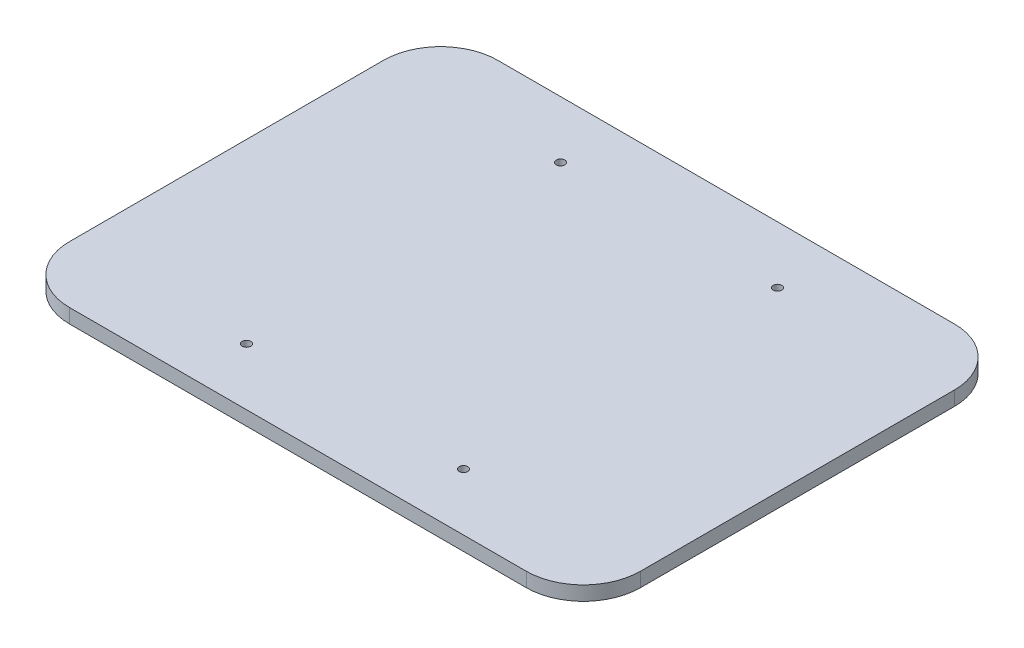
ISO-10303-21;
HEADER;
FILE_DESCRIPTION(('STEP AP214'),'2;1');
FILE_NAME('part.step','',(''),(''),'','','');
FILE_SCHEMA(('AUTOMOTIVE_DESIGN { 1 0 10303 214 1 1 1 1 }'));
ENDSEC;
DATA;
#1=APPLICATION_CONTEXT('core data for automotive mechanical design processes');
#2=APPLICATION_PROTOCOL_DEFINITION('international standard','automotive_design',2000,#1);
#3=PRODUCT_CONTEXT('',#1,'mechanical');
#4=PRODUCT('Part','Part','',(#3));
#5=PRODUCT_RELATED_PRODUCT_CATEGORY('part','',(#4));
#6=PRODUCT_DEFINITION_FORMATION('','',#4);
#7=PRODUCT_DEFINITION_CONTEXT('part definition',#1,'design');
#8=PRODUCT_DEFINITION('design','',#6,#7);
#9=PRODUCT_DEFINITION_SHAPE('','',#8);
#10=(LENGTH_UNIT() NAMED_UNIT(*) SI_UNIT(.MILLI.,.METRE.));
#11=(NAMED_UNIT(*) PLANE_ANGLE_UNIT() SI_UNIT($,.RADIAN.));
#12=(NAMED_UNIT(*) SI_UNIT($,.STERADIAN.) SOLID_ANGLE_UNIT());
#13=UNCERTAINTY_MEASURE_WITH_UNIT(LENGTH_MEASURE(1.E-05),#10,'distance_accuracy_value','');
#14=(GEOMETRIC_REPRESENTATION_CONTEXT(3) GLOBAL_UNCERTAINTY_ASSIGNED_CONTEXT((#13)) GLOBAL_UNIT_ASSIGNED_CONTEXT((#10,
#11,#12)) REPRESENTATION_CONTEXT('',''));
#15=CARTESIAN_POINT('',(0.,0.,0.));
#16=DIRECTION('',(0.,0.,1.));
#17=DIRECTION('',(1.,0.,0.));
#18=AXIS2_PLACEMENT_3D('',#15,#16,#17);
#19=CARTESIAN_POINT('',(119.18397760156,5.,-163.114483400198));
#20=DIRECTION('',(0.,-1.,0.));
#21=DIRECTION('',(0.,0.,-1.));
#22=AXIS2_PLACEMENT_3D('',#19,#20,#21);
#23=CYLINDRICAL_SURFACE('',#22,20.);
#24=CARTESIAN_POINT('',(119.18397760156,0.,-163.114483400198));
#25=DIRECTION('',(0.,1.,0.));
#26=DIRECTION('',(0.,0.,-1.));
#27=AXIS2_PLACEMENT_3D('',#24,#25,#26);
#28=CIRCLE('',#27,20.);
#29=CARTESIAN_POINT('',(139.18397760156,0.,-163.114483400198));
#30=VERTEX_POINT('',#29);
#31=CARTESIAN_POINT('',(119.18397760156,0.,-183.114483400198));
#32=VERTEX_POINT('',#31);
#33=EDGE_CURVE('E131',#30,#32,#28,.T.);
#34=ORIENTED_EDGE('',*,*,#33,.T.);
#35=DIRECTION('',(0.,-1.,0.));
#36=VECTOR('',#35,1.);
#37=CARTESIAN_POINT('',(119.18397760156,5.,-183.114483400198));
#38=LINE('',#37,#36);
#39=CARTESIAN_POINT('',(119.18397760156,5.,-183.114483400198));
#40=VERTEX_POINT('',#39);
#41=EDGE_CURVE('E11',#40,#32,#38,.T.);
#42=ORIENTED_EDGE('',*,*,#41,.F.);
#43=CARTESIAN_POINT('',(119.18397760156,5.,-163.114483400198));
#44=DIRECTION('',(0.,1.,0.));
#45=DIRECTION('',(0.,0.,-1.));
#46=AXIS2_PLACEMENT_3D('',#43,#44,#45);
#47=CIRCLE('',#46,20.);
#48=CARTESIAN_POINT('',(139.18397760156,5.,-163.114483400198));
#49=VERTEX_POINT('',#48);
#50=EDGE_CURVE('E146',#49,#40,#47,.T.);
#51=ORIENTED_EDGE('',*,*,#50,.F.);
#52=DIRECTION('',(0.,-1.,0.));
#53=VECTOR('',#52,1.);
#54=CARTESIAN_POINT('',(139.18397760156,5.,-163.114483400198));
#55=LINE('',#54,#53);
#56=EDGE_CURVE('E127',#49,#30,#55,.T.);
#57=ORIENTED_EDGE('',*,*,#56,.T.);
#58=EDGE_LOOP('',(#34,#42,#51,#57));
#59=FACE_BOUND('',#58,.T.);
#60=ADVANCED_FACE('F33',(#59),#23,.T.);
#61=CARTESIAN_POINT('',(-40.81602239844,5.,-183.114483400198));
#62=DIRECTION('',(0.,0.,1.));
#63=DIRECTION('',(1.,0.,0.));
#64=AXIS2_PLACEMENT_3D('',#61,#62,#63);
#65=PLANE('',#64);
#66=DIRECTION('',(-1.,0.,0.));
#67=VECTOR('',#66,1.);
#68=CARTESIAN_POINT('',(-40.81602239844,0.,-183.114483400198));
#69=LINE('',#68,#67);
#70=CARTESIAN_POINT('',(-40.81602239844,0.,-183.114483400198));
#71=VERTEX_POINT('',#70);
#72=EDGE_CURVE('E134',#32,#71,#69,.T.);
#73=ORIENTED_EDGE('',*,*,#72,.T.);
#74=DIRECTION('',(0.,-1.,0.));
#75=VECTOR('',#74,1.);
#76=CARTESIAN_POINT('',(-40.81602239844,5.,-183.114483400198));
#77=LINE('',#76,#75);
#78=CARTESIAN_POINT('',(-40.81602239844,5.,-183.114483400198));
#79=VERTEX_POINT('',#78);
#80=EDGE_CURVE('E42',#79,#71,#77,.T.);
#81=ORIENTED_EDGE('',*,*,#80,.F.);
#82=DIRECTION('',(-1.,0.,0.));
#83=VECTOR('',#82,1.);
#84=CARTESIAN_POINT('',(-40.81602239844,5.,-183.114483400198));
#85=LINE('',#84,#83);
#86=EDGE_CURVE('E94',#40,#79,#85,.T.);
#87=ORIENTED_EDGE('',*,*,#86,.F.);
#88=ORIENTED_EDGE('',*,*,#41,.T.);
#89=EDGE_LOOP('',(#73,#81,#87,#88));
#90=FACE_BOUND('',#89,.T.);
#91=ADVANCED_FACE('F213',(#90),#65,.F.);
#92=CARTESIAN_POINT('',(-40.81602239844,5.,-163.114483400198));
#93=DIRECTION('',(0.,-1.,0.));
#94=DIRECTION('',(0.,0.,-1.));
#95=AXIS2_PLACEMENT_3D('',#92,#93,#94);
#96=CYLINDRICAL_SURFACE('',#95,20.);
#97=CARTESIAN_POINT('',(-40.81602239844,0.,-163.114483400198));
#98=DIRECTION('',(0.,1.,0.));
#99=DIRECTION('',(0.,0.,1.));
#100=AXIS2_PLACEMENT_3D('',#97,#98,#99);
#101=CIRCLE('',#100,20.);
#102=CARTESIAN_POINT('',(-60.81602239844,0.,-163.114483400198));
#103=VERTEX_POINT('',#102);
#104=EDGE_CURVE('E137',#71,#103,#101,.T.);
#105=ORIENTED_EDGE('',*,*,#104,.T.);
#106=DIRECTION('',(0.,-1.,0.));
#107=VECTOR('',#106,1.);
#108=CARTESIAN_POINT('',(-60.81602239844,5.,-163.114483400198));
#109=LINE('',#108,#107);
#110=CARTESIAN_POINT('',(-60.81602239844,5.,-163.114483400198));
#111=VERTEX_POINT('',#110);
#112=EDGE_CURVE('E153',#111,#103,#109,.T.);
#113=ORIENTED_EDGE('',*,*,#112,.F.);
#114=CARTESIAN_POINT('',(-40.81602239844,5.,-163.114483400198));
#115=DIRECTION('',(0.,1.,0.));
#116=DIRECTION('',(0.,0.,1.));
#117=AXIS2_PLACEMENT_3D('',#114,#115,#116);
#118=CIRCLE('',#117,20.);
#119=EDGE_CURVE('E181',#79,#111,#118,.T.);
#120=ORIENTED_EDGE('',*,*,#119,.F.);
#121=ORIENTED_EDGE('',*,*,#80,.T.);
#122=EDGE_LOOP('',(#105,#113,#120,#121));
#123=FACE_BOUND('',#122,.T.);
#124=ADVANCED_FACE('F217',(#123),#96,.T.);
#125=CARTESIAN_POINT('',(-60.81602239844,5.,-163.114483400198));
#126=DIRECTION('',(1.,0.,0.));
#127=DIRECTION('',(0.,0.,-1.));
#128=AXIS2_PLACEMENT_3D('',#125,#126,#127);
#129=PLANE('',#128);
#130=DIRECTION('',(0.,0.,1.));
#131=VECTOR('',#130,1.);
#132=CARTESIAN_POINT('',(-60.81602239844,0.,-163.114483400198));
#133=LINE('',#132,#131);
#134=CARTESIAN_POINT('',(-60.81602239844,0.,-53.1144834001978));
#135=VERTEX_POINT('',#134);
#136=EDGE_CURVE('E139',#103,#135,#133,.T.);
#137=ORIENTED_EDGE('',*,*,#136,.T.);
#138=DIRECTION('',(0.,-1.,0.));
#139=VECTOR('',#138,1.);
#140=CARTESIAN_POINT('',(-60.81602239844,5.,-53.1144834001978));
#141=LINE('',#140,#139);
#142=CARTESIAN_POINT('',(-60.81602239844,5.,-53.1144834001978));
#143=VERTEX_POINT('',#142);
#144=EDGE_CURVE('E150',#143,#135,#141,.T.);
#145=ORIENTED_EDGE('',*,*,#144,.F.);
#146=DIRECTION('',(0.,0.,1.));
#147=VECTOR('',#146,1.);
#148=CARTESIAN_POINT('',(-60.81602239844,5.,-163.114483400198));
#149=LINE('',#148,#147);
#150=EDGE_CURVE('E183',#111,#143,#149,.T.);
#151=ORIENTED_EDGE('',*,*,#150,.F.);
#152=ORIENTED_EDGE('',*,*,#112,.T.);
#153=EDGE_LOOP('',(#137,#145,#151,#152));
#154=FACE_BOUND('',#153,.T.);
#155=ADVANCED_FACE('F189',(#154),#129,.F.);
#156=CARTESIAN_POINT('',(-40.81602239844,5.,-53.1144834001977));
#157=DIRECTION('',(0.,-1.,0.));
#158=DIRECTION('',(0.,0.,-1.));
#159=AXIS2_PLACEMENT_3D('',#156,#157,#158);
#160=CYLINDRICAL_SURFACE('',#159,20.);
#161=CARTESIAN_POINT('',(-40.81602239844,0.,-53.1144834001977));
#162=DIRECTION('',(0.,1.,0.));
#163=DIRECTION('',(0.,0.,1.));
#164=AXIS2_PLACEMENT_3D('',#161,#162,#163);
#165=CIRCLE('',#164,20.);
#166=CARTESIAN_POINT('',(-40.81602239844,0.,-33.1144834001977));
#167=VERTEX_POINT('',#166);
#168=EDGE_CURVE('E141',#135,#167,#165,.T.);
#169=ORIENTED_EDGE('',*,*,#168,.T.);
#170=DIRECTION('',(0.,-1.,0.));
#171=VECTOR('',#170,1.);
#172=CARTESIAN_POINT('',(-40.81602239844,5.,-33.1144834001977));
#173=LINE('',#172,#171);
#174=CARTESIAN_POINT('',(-40.81602239844,5.,-33.1144834001977));
#175=VERTEX_POINT('',#174);
#176=EDGE_CURVE('E122',#175,#167,#173,.T.);
#177=ORIENTED_EDGE('',*,*,#176,.F.);
#178=CARTESIAN_POINT('',(-40.81602239844,5.,-53.1144834001977));
#179=DIRECTION('',(0.,1.,0.));
#180=DIRECTION('',(0.,0.,1.));
#181=AXIS2_PLACEMENT_3D('',#178,#179,#180);
#182=CIRCLE('',#181,20.);
#183=EDGE_CURVE('E113',#143,#175,#182,.T.);
#184=ORIENTED_EDGE('',*,*,#183,.F.);
#185=ORIENTED_EDGE('',*,*,#144,.T.);
#186=EDGE_LOOP('',(#169,#177,#184,#185));
#187=FACE_BOUND('',#186,.T.);
#188=ADVANCED_FACE('F193',(#187),#160,.T.);
#189=CARTESIAN_POINT('',(-40.8160223984398,5.,-33.1144834001977));
#190=DIRECTION('',(0.,0.,-1.));
#191=DIRECTION('',(-1.,0.,0.));
#192=AXIS2_PLACEMENT_3D('',#189,#190,#191);
#193=PLANE('',#192);
#194=DIRECTION('',(1.,0.,0.));
#195=VECTOR('',#194,1.);
#196=CARTESIAN_POINT('',(-40.8160223984398,0.,-33.1144834001977));
#197=LINE('',#196,#195);
#198=CARTESIAN_POINT('',(119.18397760156,0.,-33.1144834001977));
#199=VERTEX_POINT('',#198);
#200=EDGE_CURVE('E121',#167,#199,#197,.T.);
#201=ORIENTED_EDGE('',*,*,#200,.T.);
#202=DIRECTION('',(0.,-1.,0.));
#203=VECTOR('',#202,1.);
#204=CARTESIAN_POINT('',(119.18397760156,5.,-33.1144834001977));
#205=LINE('',#204,#203);
#206=CARTESIAN_POINT('',(119.18397760156,5.,-33.1144834001977));
#207=VERTEX_POINT('',#206);
#208=EDGE_CURVE('E118',#207,#199,#205,.T.);
#209=ORIENTED_EDGE('',*,*,#208,.F.);
#210=DIRECTION('',(1.,0.,0.));
#211=VECTOR('',#210,1.);
#212=CARTESIAN_POINT('',(-40.8160223984398,5.,-33.1144834001977));
#213=LINE('',#212,#211);
#214=EDGE_CURVE('E107',#175,#207,#213,.T.);
#215=ORIENTED_EDGE('',*,*,#214,.F.);
#216=ORIENTED_EDGE('',*,*,#176,.T.);
#217=EDGE_LOOP('',(#201,#209,#215,#216));
#218=FACE_BOUND('',#217,.T.);
#219=ADVANCED_FACE('F119',(#218),#193,.F.);
#220=CARTESIAN_POINT('',(119.18397760156,5.,-53.1144834001977));
#221=DIRECTION('',(0.,-1.,0.));
#222=DIRECTION('',(0.,0.,-1.));
#223=AXIS2_PLACEMENT_3D('',#220,#221,#222);
#224=CYLINDRICAL_SURFACE('',#223,20.);
#225=CARTESIAN_POINT('',(119.18397760156,0.,-53.1144834001977));
#226=DIRECTION('',(0.,1.,0.));
#227=DIRECTION('',(0.,0.,1.));
#228=AXIS2_PLACEMENT_3D('',#225,#226,#227);
#229=CIRCLE('',#228,20.);
#230=CARTESIAN_POINT('',(139.18397760156,0.,-53.1144834001977));
#231=VERTEX_POINT('',#230);
#232=EDGE_CURVE('E80',#199,#231,#229,.T.);
#233=ORIENTED_EDGE('',*,*,#232,.T.);
#234=DIRECTION('',(0.,-1.,0.));
#235=VECTOR('',#234,1.);
#236=CARTESIAN_POINT('',(139.18397760156,5.,-53.1144834001977));
#237=LINE('',#236,#235);
#238=CARTESIAN_POINT('',(139.18397760156,5.,-53.1144834001977));
#239=VERTEX_POINT('',#238);
#240=EDGE_CURVE('E123',#239,#231,#237,.T.);
#241=ORIENTED_EDGE('',*,*,#240,.F.);
#242=CARTESIAN_POINT('',(119.18397760156,5.,-53.1144834001977));
#243=DIRECTION('',(0.,1.,0.));
#244=DIRECTION('',(0.,0.,1.));
#245=AXIS2_PLACEMENT_3D('',#242,#243,#244);
#246=CIRCLE('',#245,20.);
#247=EDGE_CURVE('E111',#207,#239,#246,.T.);
#248=ORIENTED_EDGE('',*,*,#247,.F.);
#249=ORIENTED_EDGE('',*,*,#208,.T.);
#250=EDGE_LOOP('',(#233,#241,#248,#249));
#251=FACE_BOUND('',#250,.T.);
#252=ADVANCED_FACE('F125',(#251),#224,.T.);
#253=CARTESIAN_POINT('',(139.18397760156,5.,-163.114483400198));
#254=DIRECTION('',(-1.,0.,0.));
#255=DIRECTION('',(0.,0.,1.));
#256=AXIS2_PLACEMENT_3D('',#253,#254,#255);
#257=PLANE('',#256);
#258=DIRECTION('',(0.,0.,-1.));
#259=VECTOR('',#258,1.);
#260=CARTESIAN_POINT('',(139.18397760156,0.,-163.114483400198));
#261=LINE('',#260,#259);
#262=EDGE_CURVE('E86',#231,#30,#261,.T.);
#263=ORIENTED_EDGE('',*,*,#262,.T.);
#264=ORIENTED_EDGE('',*,*,#56,.F.);
#265=DIRECTION('',(0.,0.,-1.));
#266=VECTOR('',#265,1.);
#267=CARTESIAN_POINT('',(139.18397760156,5.,-163.114483400198));
#268=LINE('',#267,#266);
#269=EDGE_CURVE('E51',#239,#49,#268,.T.);
#270=ORIENTED_EDGE('',*,*,#269,.F.);
#271=ORIENTED_EDGE('',*,*,#240,.T.);
#272=EDGE_LOOP('',(#263,#264,#270,#271));
#273=FACE_BOUND('',#272,.T.);
#274=ADVANCED_FACE('F201',(#273),#257,.F.);
#275=CARTESIAN_POINT('',(119.18397760156,5.,-163.114483400198));
#276=DIRECTION('',(0.,-1.,0.));
#277=DIRECTION('',(0.,0.,-1.));
#278=AXIS2_PLACEMENT_3D('',#275,#276,#277);
#279=PLANE('',#278);
#280=CARTESIAN_POINT('',(77.18397760156,5.,-163.114483400198));
#281=DIRECTION('',(0.,1.,0.));
#282=DIRECTION('',(0.,0.,1.));
#283=AXIS2_PLACEMENT_3D('',#280,#281,#282);
#284=CIRCLE('',#283,1.5);
#285=CARTESIAN_POINT('',(77.18397760156,5.,-161.614483400198));
#286=VERTEX_POINT('',#285);
#287=EDGE_CURVE('E164',#286,#286,#284,.T.);
#288=ORIENTED_EDGE('',*,*,#287,.F.);
#289=EDGE_LOOP('',(#288));
#290=FACE_BOUND('',#289,.T.);
#291=CARTESIAN_POINT('',(77.18397760156,5.,-53.1144834001977));
#292=DIRECTION('',(0.,1.,0.));
#293=DIRECTION('',(0.,0.,1.));
#294=AXIS2_PLACEMENT_3D('',#291,#292,#293);
#295=CIRCLE('',#294,1.5);
#296=CARTESIAN_POINT('',(77.18397760156,5.,-51.6144834001977));
#297=VERTEX_POINT('',#296);
#298=EDGE_CURVE('E300',#297,#297,#295,.T.);
#299=ORIENTED_EDGE('',*,*,#298,.F.);
#300=EDGE_LOOP('',(#299));
#301=FACE_BOUND('',#300,.T.);
#302=CARTESIAN_POINT('',(1.18397760156001,5.,-53.1144834001977));
#303=DIRECTION('',(0.,1.,0.));
#304=DIRECTION('',(0.,0.,1.));
#305=AXIS2_PLACEMENT_3D('',#302,#303,#304);
#306=CIRCLE('',#305,1.5);
#307=CARTESIAN_POINT('',(1.18397760156001,5.,-51.6144834001977));
#308=VERTEX_POINT('',#307);
#309=EDGE_CURVE('E177',#308,#308,#306,.T.);
#310=ORIENTED_EDGE('',*,*,#309,.F.);
#311=EDGE_LOOP('',(#310));
#312=FACE_BOUND('',#311,.T.);
#313=CARTESIAN_POINT('',(1.18397760156001,5.,-163.114483400198));
#314=DIRECTION('',(0.,1.,0.));
#315=DIRECTION('',(0.,0.,1.));
#316=AXIS2_PLACEMENT_3D('',#313,#314,#315);
#317=CIRCLE('',#316,1.5);
#318=CARTESIAN_POINT('',(1.18397760156001,5.,-161.614483400198));
#319=VERTEX_POINT('',#318);
#320=EDGE_CURVE('E160',#319,#319,#317,.T.);
#321=ORIENTED_EDGE('',*,*,#320,.F.);
#322=EDGE_LOOP('',(#321));
#323=FACE_BOUND('',#322,.T.);
#324=ORIENTED_EDGE('',*,*,#50,.T.);
#325=ORIENTED_EDGE('',*,*,#86,.T.);
#326=ORIENTED_EDGE('',*,*,#119,.T.);
#327=ORIENTED_EDGE('',*,*,#150,.T.);
#328=ORIENTED_EDGE('',*,*,#183,.T.);
#329=ORIENTED_EDGE('',*,*,#214,.T.);
#330=ORIENTED_EDGE('',*,*,#247,.T.);
#331=ORIENTED_EDGE('',*,*,#269,.T.);
#332=EDGE_LOOP('',(#324,#325,#326,#327,#328,#329,#330,#331));
#333=FACE_BOUND('',#332,.T.);
#334=ADVANCED_FACE('F109',(#290,#301,#312,#323,#333),#279,.F.);
#335=CARTESIAN_POINT('',(119.18397760156,0.,-163.114483400198));
#336=DIRECTION('',(0.,-1.,0.));
#337=DIRECTION('',(0.,0.,-1.));
#338=AXIS2_PLACEMENT_3D('',#335,#336,#337);
#339=PLANE('',#338);
#340=CARTESIAN_POINT('',(77.18397760156,0.,-163.114483400198));
#341=DIRECTION('',(0.,-1.,0.));
#342=DIRECTION('',(0.,0.,-1.));
#343=AXIS2_PLACEMENT_3D('',#340,#341,#342);
#344=CIRCLE('',#343,1.5);
#345=CARTESIAN_POINT('',(77.18397760156,0.,-164.614483400198));
#346=VERTEX_POINT('',#345);
#347=EDGE_CURVE('E36',#346,#346,#344,.T.);
#348=ORIENTED_EDGE('',*,*,#347,.F.);
#349=EDGE_LOOP('',(#348));
#350=FACE_BOUND('',#349,.T.);
#351=CARTESIAN_POINT('',(77.18397760156,0.,-53.1144834001977));
#352=DIRECTION('',(0.,-1.,0.));
#353=DIRECTION('',(0.,0.,-1.));
#354=AXIS2_PLACEMENT_3D('',#351,#352,#353);
#355=CIRCLE('',#354,1.5);
#356=CARTESIAN_POINT('',(77.18397760156,0.,-54.6144834001977));
#357=VERTEX_POINT('',#356);
#358=EDGE_CURVE('E163',#357,#357,#355,.T.);
#359=ORIENTED_EDGE('',*,*,#358,.F.);
#360=EDGE_LOOP('',(#359));
#361=FACE_BOUND('',#360,.T.);
#362=CARTESIAN_POINT('',(1.18397760156001,0.,-53.1144834001977));
#363=DIRECTION('',(0.,-1.,0.));
#364=DIRECTION('',(0.,0.,-1.));
#365=AXIS2_PLACEMENT_3D('',#362,#363,#364);
#366=CIRCLE('',#365,1.5);
#367=CARTESIAN_POINT('',(1.18397760156001,0.,-54.6144834001977));
#368=VERTEX_POINT('',#367);
#369=EDGE_CURVE('E161',#368,#368,#366,.T.);
#370=ORIENTED_EDGE('',*,*,#369,.F.);
#371=EDGE_LOOP('',(#370));
#372=FACE_BOUND('',#371,.T.);
#373=CARTESIAN_POINT('',(1.18397760156001,0.,-163.114483400198));
#374=DIRECTION('',(0.,-1.,0.));
#375=DIRECTION('',(0.,0.,-1.));
#376=AXIS2_PLACEMENT_3D('',#373,#374,#375);
#377=CIRCLE('',#376,1.5);
#378=CARTESIAN_POINT('',(1.18397760156001,0.,-164.614483400198));
#379=VERTEX_POINT('',#378);
#380=EDGE_CURVE('E135',#379,#379,#377,.T.);
#381=ORIENTED_EDGE('',*,*,#380,.F.);
#382=EDGE_LOOP('',(#381));
#383=FACE_BOUND('',#382,.T.);
#384=ORIENTED_EDGE('',*,*,#33,.F.);
#385=ORIENTED_EDGE('',*,*,#262,.F.);
#386=ORIENTED_EDGE('',*,*,#232,.F.);
#387=ORIENTED_EDGE('',*,*,#200,.F.);
#388=ORIENTED_EDGE('',*,*,#168,.F.);
#389=ORIENTED_EDGE('',*,*,#136,.F.);
#390=ORIENTED_EDGE('',*,*,#104,.F.);
#391=ORIENTED_EDGE('',*,*,#72,.F.);
#392=EDGE_LOOP('',(#384,#385,#386,#387,#388,#389,#390,#391));
#393=FACE_BOUND('',#392,.T.);
#394=ADVANCED_FACE('F196',(#350,#361,#372,#383,#393),#339,.T.);
#395=CARTESIAN_POINT('',(1.18397760156001,-5.,-163.114483400198));
#396=DIRECTION('',(0.,1.,0.));
#397=DIRECTION('',(0.,0.,1.));
#398=AXIS2_PLACEMENT_3D('',#395,#396,#397);
#399=CYLINDRICAL_SURFACE('',#398,1.5);
#400=ORIENTED_EDGE('',*,*,#380,.T.);
#401=EDGE_LOOP('',(#400));
#402=FACE_BOUND('',#401,.T.);
#403=ORIENTED_EDGE('',*,*,#320,.T.);
#404=EDGE_LOOP('',(#403));
#405=FACE_BOUND('',#404,.T.);
#406=ADVANCED_FACE('F256',(#402,#405),#399,.F.);
#407=CARTESIAN_POINT('',(1.18397760156001,-5.,-53.1144834001977));
#408=DIRECTION('',(0.,1.,0.));
#409=DIRECTION('',(0.,0.,1.));
#410=AXIS2_PLACEMENT_3D('',#407,#408,#409);
#411=CYLINDRICAL_SURFACE('',#410,1.5);
#412=ORIENTED_EDGE('',*,*,#369,.T.);
#413=EDGE_LOOP('',(#412));
#414=FACE_BOUND('',#413,.T.);
#415=ORIENTED_EDGE('',*,*,#309,.T.);
#416=EDGE_LOOP('',(#415));
#417=FACE_BOUND('',#416,.T.);
#418=ADVANCED_FACE('F265',(#414,#417),#411,.F.);
#419=CARTESIAN_POINT('',(77.18397760156,-5.,-53.1144834001977));
#420=DIRECTION('',(0.,1.,0.));
#421=DIRECTION('',(0.,0.,1.));
#422=AXIS2_PLACEMENT_3D('',#419,#420,#421);
#423=CYLINDRICAL_SURFACE('',#422,1.5);
#424=ORIENTED_EDGE('',*,*,#358,.T.);
#425=EDGE_LOOP('',(#424));
#426=FACE_BOUND('',#425,.T.);
#427=ORIENTED_EDGE('',*,*,#298,.T.);
#428=EDGE_LOOP('',(#427));
#429=FACE_BOUND('',#428,.T.);
#430=ADVANCED_FACE('F275',(#426,#429),#423,.F.);
#431=CARTESIAN_POINT('',(77.18397760156,-5.,-163.114483400198));
#432=DIRECTION('',(0.,1.,0.));
#433=DIRECTION('',(0.,0.,1.));
#434=AXIS2_PLACEMENT_3D('',#431,#432,#433);
#435=CYLINDRICAL_SURFACE('',#434,1.5);
#436=ORIENTED_EDGE('',*,*,#347,.T.);
#437=EDGE_LOOP('',(#436));
#438=FACE_BOUND('',#437,.T.);
#439=ORIENTED_EDGE('',*,*,#287,.T.);
#440=EDGE_LOOP('',(#439));
#441=FACE_BOUND('',#440,.T.);
#442=ADVANCED_FACE('F285',(#438,#441),#435,.F.);
#443=CLOSED_SHELL('',(#60,#91,#124,#155,#188,#219,#252,#274,#334,#394,#406,#418,#430,#442));
#444=MANIFOLD_SOLID_BREP('B2',#443);
#445=ADVANCED_BREP_SHAPE_REPRESENTATION('',(#18,#444),#14);
#446=SHAPE_DEFINITION_REPRESENTATION(#9,#445);
ENDSEC;
END-ISO-10303-21;
